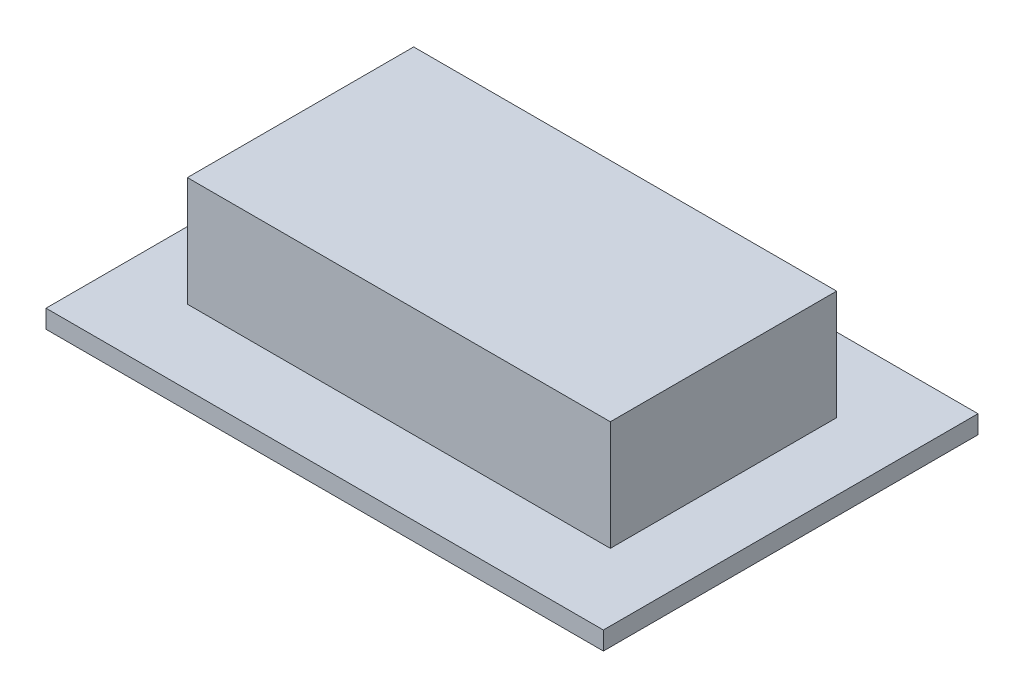
ISO-10303-21;
HEADER;
FILE_DESCRIPTION(('STEP AP214'),'2;1');
FILE_NAME('part.step','',(''),(''),'','','');
FILE_SCHEMA(('AUTOMOTIVE_DESIGN { 1 0 10303 214 1 1 1 1 }'));
ENDSEC;
DATA;
#1=APPLICATION_CONTEXT('core data for automotive mechanical design processes');
#2=APPLICATION_PROTOCOL_DEFINITION('international standard','automotive_design',2000,#1);
#3=PRODUCT_CONTEXT('',#1,'mechanical');
#4=PRODUCT('Part','Part','',(#3));
#5=PRODUCT_RELATED_PRODUCT_CATEGORY('part','',(#4));
#6=PRODUCT_DEFINITION_FORMATION('','',#4);
#7=PRODUCT_DEFINITION_CONTEXT('part definition',#1,'design');
#8=PRODUCT_DEFINITION('design','',#6,#7);
#9=PRODUCT_DEFINITION_SHAPE('','',#8);
#10=(LENGTH_UNIT() NAMED_UNIT(*) SI_UNIT(.MILLI.,.METRE.));
#11=(NAMED_UNIT(*) PLANE_ANGLE_UNIT() SI_UNIT($,.RADIAN.));
#12=(NAMED_UNIT(*) SI_UNIT($,.STERADIAN.) SOLID_ANGLE_UNIT());
#13=UNCERTAINTY_MEASURE_WITH_UNIT(LENGTH_MEASURE(1.E-05),#10,'distance_accuracy_value','');
#14=(GEOMETRIC_REPRESENTATION_CONTEXT(3) GLOBAL_UNCERTAINTY_ASSIGNED_CONTEXT((#13)) GLOBAL_UNIT_ASSIGNED_CONTEXT((#10,
#11,#12)) REPRESENTATION_CONTEXT('',''));
#15=CARTESIAN_POINT('',(0.,0.,0.));
#16=DIRECTION('',(0.,0.,1.));
#17=DIRECTION('',(1.,0.,0.));
#18=AXIS2_PLACEMENT_3D('',#15,#16,#17);
#19=CARTESIAN_POINT('',(0.,2.,0.));
#20=DIRECTION('',(0.,-1.,0.));
#21=DIRECTION('',(0.,0.,-1.));
#22=AXIS2_PLACEMENT_3D('',#19,#20,#21);
#23=PLANE('',#22);
#24=DIRECTION('',(0.,0.,-1.));
#25=VECTOR('',#24,1.);
#26=CARTESIAN_POINT('',(30.5,2.,20.5));
#27=LINE('',#26,#25);
#28=CARTESIAN_POINT('',(30.5,2.,20.5));
#29=VERTEX_POINT('',#28);
#30=CARTESIAN_POINT('',(30.5,2.,-20.5));
#31=VERTEX_POINT('',#30);
#32=EDGE_CURVE('E187',#29,#31,#27,.T.);
#33=ORIENTED_EDGE('',*,*,#32,.T.);
#34=DIRECTION('',(-1.,0.,0.));
#35=VECTOR('',#34,1.);
#36=CARTESIAN_POINT('',(-30.5,2.,-20.5));
#37=LINE('',#36,#35);
#38=CARTESIAN_POINT('',(-30.5,2.,-20.5));
#39=VERTEX_POINT('',#38);
#40=EDGE_CURVE('E190',#31,#39,#37,.T.);
#41=ORIENTED_EDGE('',*,*,#40,.T.);
#42=DIRECTION('',(0.,0.,1.));
#43=VECTOR('',#42,1.);
#44=CARTESIAN_POINT('',(-30.5,2.,20.5));
#45=LINE('',#44,#43);
#46=CARTESIAN_POINT('',(-30.5,2.,20.5));
#47=VERTEX_POINT('',#46);
#48=EDGE_CURVE('E193',#39,#47,#45,.T.);
#49=ORIENTED_EDGE('',*,*,#48,.T.);
#50=DIRECTION('',(1.,0.,0.));
#51=VECTOR('',#50,1.);
#52=CARTESIAN_POINT('',(-30.5,2.,20.5));
#53=LINE('',#52,#51);
#54=EDGE_CURVE('E195',#47,#29,#53,.T.);
#55=ORIENTED_EDGE('',*,*,#54,.T.);
#56=EDGE_LOOP('',(#33,#41,#49,#55));
#57=FACE_BOUND('',#56,.T.);
#58=DIRECTION('',(0.,0.,-1.));
#59=VECTOR('',#58,1.);
#60=CARTESIAN_POINT('',(23.1441638533903,2.,-12.383538891067));
#61=LINE('',#60,#59);
#62=CARTESIAN_POINT('',(23.1441638533903,2.,12.383538891067));
#63=VERTEX_POINT('',#62);
#64=CARTESIAN_POINT('',(23.1441638533903,2.,-12.383538891067));
#65=VERTEX_POINT('',#64);
#66=EDGE_CURVE('E148',#63,#65,#61,.T.);
#67=ORIENTED_EDGE('',*,*,#66,.F.);
#68=DIRECTION('',(1.,0.,0.));
#69=VECTOR('',#68,1.);
#70=CARTESIAN_POINT('',(-23.1441638533903,2.,12.383538891067));
#71=LINE('',#70,#69);
#72=CARTESIAN_POINT('',(-23.1441638533903,2.,12.383538891067));
#73=VERTEX_POINT('',#72);
#74=EDGE_CURVE('E161',#73,#63,#71,.T.);
#75=ORIENTED_EDGE('',*,*,#74,.F.);
#76=DIRECTION('',(0.,0.,1.));
#77=VECTOR('',#76,1.);
#78=CARTESIAN_POINT('',(-23.1441638533903,2.,-12.383538891067));
#79=LINE('',#78,#77);
#80=CARTESIAN_POINT('',(-23.1441638533903,2.,-12.383538891067));
#81=VERTEX_POINT('',#80);
#82=EDGE_CURVE('E170',#81,#73,#79,.T.);
#83=ORIENTED_EDGE('',*,*,#82,.F.);
#84=DIRECTION('',(-1.,0.,0.));
#85=VECTOR('',#84,1.);
#86=CARTESIAN_POINT('',(-23.1441638533903,2.,-12.383538891067));
#87=LINE('',#86,#85);
#88=EDGE_CURVE('E151',#65,#81,#87,.T.);
#89=ORIENTED_EDGE('',*,*,#88,.F.);
#90=EDGE_LOOP('',(#67,#75,#83,#89));
#91=FACE_BOUND('',#90,.T.);
#92=ADVANCED_FACE('F39',(#57,#91),#23,.F.);
#93=CARTESIAN_POINT('',(30.5,2.,20.5));
#94=DIRECTION('',(-1.,0.,0.));
#95=DIRECTION('',(0.,0.,1.));
#96=AXIS2_PLACEMENT_3D('',#93,#94,#95);
#97=PLANE('',#96);
#98=DIRECTION('',(0.,0.,-1.));
#99=VECTOR('',#98,1.);
#100=CARTESIAN_POINT('',(30.5,0.,20.5));
#101=LINE('',#100,#99);
#102=CARTESIAN_POINT('',(30.5,0.,20.5));
#103=VERTEX_POINT('',#102);
#104=CARTESIAN_POINT('',(30.5,0.,-20.5));
#105=VERTEX_POINT('',#104);
#106=EDGE_CURVE('E186',#103,#105,#101,.T.);
#107=ORIENTED_EDGE('',*,*,#106,.T.);
#108=DIRECTION('',(0.,-1.,0.));
#109=VECTOR('',#108,1.);
#110=CARTESIAN_POINT('',(30.5,2.,-20.5));
#111=LINE('',#110,#109);
#112=EDGE_CURVE('E11',#31,#105,#111,.T.);
#113=ORIENTED_EDGE('',*,*,#112,.F.);
#114=ORIENTED_EDGE('',*,*,#32,.F.);
#115=DIRECTION('',(0.,-1.,0.));
#116=VECTOR('',#115,1.);
#117=CARTESIAN_POINT('',(30.5,2.,20.5));
#118=LINE('',#117,#116);
#119=EDGE_CURVE('E197',#29,#103,#118,.T.);
#120=ORIENTED_EDGE('',*,*,#119,.T.);
#121=EDGE_LOOP('',(#107,#113,#114,#120));
#122=FACE_BOUND('',#121,.T.);
#123=ADVANCED_FACE('F41',(#122),#97,.F.);
#124=CARTESIAN_POINT('',(-30.5,2.,-20.5));
#125=DIRECTION('',(0.,0.,1.));
#126=DIRECTION('',(1.,0.,0.));
#127=AXIS2_PLACEMENT_3D('',#124,#125,#126);
#128=PLANE('',#127);
#129=DIRECTION('',(-1.,0.,0.));
#130=VECTOR('',#129,1.);
#131=CARTESIAN_POINT('',(-30.5,0.,-20.5));
#132=LINE('',#131,#130);
#133=CARTESIAN_POINT('',(-30.5,0.,-20.5));
#134=VERTEX_POINT('',#133);
#135=EDGE_CURVE('E200',#105,#134,#132,.T.);
#136=ORIENTED_EDGE('',*,*,#135,.T.);
#137=DIRECTION('',(0.,-1.,0.));
#138=VECTOR('',#137,1.);
#139=CARTESIAN_POINT('',(-30.5,2.,-20.5));
#140=LINE('',#139,#138);
#141=EDGE_CURVE('E47',#39,#134,#140,.T.);
#142=ORIENTED_EDGE('',*,*,#141,.F.);
#143=ORIENTED_EDGE('',*,*,#40,.F.);
#144=ORIENTED_EDGE('',*,*,#112,.T.);
#145=EDGE_LOOP('',(#136,#142,#143,#144));
#146=FACE_BOUND('',#145,.T.);
#147=ADVANCED_FACE('F230',(#146),#128,.F.);
#148=CARTESIAN_POINT('',(-30.5,2.,20.5));
#149=DIRECTION('',(1.,0.,0.));
#150=DIRECTION('',(0.,0.,-1.));
#151=AXIS2_PLACEMENT_3D('',#148,#149,#150);
#152=PLANE('',#151);
#153=DIRECTION('',(0.,0.,1.));
#154=VECTOR('',#153,1.);
#155=CARTESIAN_POINT('',(-30.5,0.,20.5));
#156=LINE('',#155,#154);
#157=CARTESIAN_POINT('',(-30.5,0.,20.5));
#158=VERTEX_POINT('',#157);
#159=EDGE_CURVE('E202',#134,#158,#156,.T.);
#160=ORIENTED_EDGE('',*,*,#159,.T.);
#161=DIRECTION('',(0.,-1.,0.));
#162=VECTOR('',#161,1.);
#163=CARTESIAN_POINT('',(-30.5,2.,20.5));
#164=LINE('',#163,#162);
#165=EDGE_CURVE('E207',#47,#158,#164,.T.);
#166=ORIENTED_EDGE('',*,*,#165,.F.);
#167=ORIENTED_EDGE('',*,*,#48,.F.);
#168=ORIENTED_EDGE('',*,*,#141,.T.);
#169=EDGE_LOOP('',(#160,#166,#167,#168));
#170=FACE_BOUND('',#169,.T.);
#171=ADVANCED_FACE('F214',(#170),#152,.F.);
#172=CARTESIAN_POINT('',(-30.5,2.,20.5));
#173=DIRECTION('',(0.,0.,-1.));
#174=DIRECTION('',(-1.,0.,0.));
#175=AXIS2_PLACEMENT_3D('',#172,#173,#174);
#176=PLANE('',#175);
#177=DIRECTION('',(1.,0.,0.));
#178=VECTOR('',#177,1.);
#179=CARTESIAN_POINT('',(-30.5,0.,20.5));
#180=LINE('',#179,#178);
#181=EDGE_CURVE('E191',#158,#103,#180,.T.);
#182=ORIENTED_EDGE('',*,*,#181,.T.);
#183=ORIENTED_EDGE('',*,*,#119,.F.);
#184=ORIENTED_EDGE('',*,*,#54,.F.);
#185=ORIENTED_EDGE('',*,*,#165,.T.);
#186=EDGE_LOOP('',(#182,#183,#184,#185));
#187=FACE_BOUND('',#186,.T.);
#188=ADVANCED_FACE('F223',(#187),#176,.F.);
#189=CARTESIAN_POINT('',(0.,0.,0.));
#190=DIRECTION('',(0.,-1.,0.));
#191=DIRECTION('',(0.,0.,-1.));
#192=AXIS2_PLACEMENT_3D('',#189,#190,#191);
#193=PLANE('',#192);
#194=DIRECTION('',(0.,0.,1.));
#195=VECTOR('',#194,1.);
#196=CARTESIAN_POINT('',(10.2642986810793,0.,7.47011110024687));
#197=LINE('',#196,#195);
#198=CARTESIAN_POINT('',(10.2642986810793,0.,-7.47011110024687));
#199=VERTEX_POINT('',#198);
#200=CARTESIAN_POINT('',(10.2642986810793,0.,7.47011110024687));
#201=VERTEX_POINT('',#200);
#202=EDGE_CURVE('E54',#199,#201,#197,.T.);
#203=ORIENTED_EDGE('',*,*,#202,.F.);
#204=DIRECTION('',(1.,0.,0.));
#205=VECTOR('',#204,1.);
#206=CARTESIAN_POINT('',(-10.2642986810793,0.,-7.47011110024687));
#207=LINE('',#206,#205);
#208=CARTESIAN_POINT('',(-10.2642986810793,0.,-7.47011110024687));
#209=VERTEX_POINT('',#208);
#210=EDGE_CURVE('E58',#209,#199,#207,.T.);
#211=ORIENTED_EDGE('',*,*,#210,.F.);
#212=DIRECTION('',(0.,0.,-1.));
#213=VECTOR('',#212,1.);
#214=CARTESIAN_POINT('',(-10.2642986810793,0.,7.47011110024687));
#215=LINE('',#214,#213);
#216=CARTESIAN_POINT('',(-10.2642986810793,0.,7.47011110024687));
#217=VERTEX_POINT('',#216);
#218=EDGE_CURVE('E374',#217,#209,#215,.T.);
#219=ORIENTED_EDGE('',*,*,#218,.F.);
#220=DIRECTION('',(-1.,0.,0.));
#221=VECTOR('',#220,1.);
#222=CARTESIAN_POINT('',(-10.2642986810793,0.,7.47011110024687));
#223=LINE('',#222,#221);
#224=EDGE_CURVE('E380',#201,#217,#223,.T.);
#225=ORIENTED_EDGE('',*,*,#224,.F.);
#226=EDGE_LOOP('',(#203,#211,#219,#225));
#227=FACE_BOUND('',#226,.T.);
#228=ORIENTED_EDGE('',*,*,#106,.F.);
#229=ORIENTED_EDGE('',*,*,#181,.F.);
#230=ORIENTED_EDGE('',*,*,#159,.F.);
#231=ORIENTED_EDGE('',*,*,#135,.F.);
#232=EDGE_LOOP('',(#228,#229,#230,#231));
#233=FACE_BOUND('',#232,.T.);
#234=ADVANCED_FACE('F220',(#227,#233),#193,.T.);
#235=CARTESIAN_POINT('',(23.1441638533903,14.,-12.383538891067));
#236=DIRECTION('',(-1.,0.,0.));
#237=DIRECTION('',(0.,0.,1.));
#238=AXIS2_PLACEMENT_3D('',#235,#236,#237);
#239=PLANE('',#238);
#240=ORIENTED_EDGE('',*,*,#66,.T.);
#241=DIRECTION('',(0.,-1.,0.));
#242=VECTOR('',#241,1.);
#243=CARTESIAN_POINT('',(23.1441638533903,14.,-12.383538891067));
#244=LINE('',#243,#242);
#245=CARTESIAN_POINT('',(23.1441638533903,14.,-12.383538891067));
#246=VERTEX_POINT('',#245);
#247=EDGE_CURVE('E183',#246,#65,#244,.T.);
#248=ORIENTED_EDGE('',*,*,#247,.F.);
#249=DIRECTION('',(0.,0.,-1.));
#250=VECTOR('',#249,1.);
#251=CARTESIAN_POINT('',(23.1441638533903,14.,-12.383538891067));
#252=LINE('',#251,#250);
#253=CARTESIAN_POINT('',(23.1441638533903,14.,12.383538891067));
#254=VERTEX_POINT('',#253);
#255=EDGE_CURVE('E157',#254,#246,#252,.T.);
#256=ORIENTED_EDGE('',*,*,#255,.F.);
#257=DIRECTION('',(0.,-1.,0.));
#258=VECTOR('',#257,1.);
#259=CARTESIAN_POINT('',(23.1441638533903,14.,12.383538891067));
#260=LINE('',#259,#258);
#261=EDGE_CURVE('E166',#254,#63,#260,.T.);
#262=ORIENTED_EDGE('',*,*,#261,.T.);
#263=EDGE_LOOP('',(#240,#248,#256,#262));
#264=FACE_BOUND('',#263,.T.);
#265=ADVANCED_FACE('F245',(#264),#239,.F.);
#266=CARTESIAN_POINT('',(-23.1441638533903,14.,-12.383538891067));
#267=DIRECTION('',(0.,0.,1.));
#268=DIRECTION('',(1.,0.,0.));
#269=AXIS2_PLACEMENT_3D('',#266,#267,#268);
#270=PLANE('',#269);
#271=ORIENTED_EDGE('',*,*,#88,.T.);
#272=DIRECTION('',(0.,-1.,0.));
#273=VECTOR('',#272,1.);
#274=CARTESIAN_POINT('',(-23.1441638533903,14.,-12.383538891067));
#275=LINE('',#274,#273);
#276=CARTESIAN_POINT('',(-23.1441638533903,14.,-12.383538891067));
#277=VERTEX_POINT('',#276);
#278=EDGE_CURVE('E180',#277,#81,#275,.T.);
#279=ORIENTED_EDGE('',*,*,#278,.F.);
#280=DIRECTION('',(-1.,0.,0.));
#281=VECTOR('',#280,1.);
#282=CARTESIAN_POINT('',(-23.1441638533903,14.,-12.383538891067));
#283=LINE('',#282,#281);
#284=EDGE_CURVE('E160',#246,#277,#283,.T.);
#285=ORIENTED_EDGE('',*,*,#284,.F.);
#286=ORIENTED_EDGE('',*,*,#247,.T.);
#287=EDGE_LOOP('',(#271,#279,#285,#286));
#288=FACE_BOUND('',#287,.T.);
#289=ADVANCED_FACE('F284',(#288),#270,.F.);
#290=CARTESIAN_POINT('',(-23.1441638533903,14.,-12.383538891067));
#291=DIRECTION('',(1.,0.,0.));
#292=DIRECTION('',(0.,0.,-1.));
#293=AXIS2_PLACEMENT_3D('',#290,#291,#292);
#294=PLANE('',#293);
#295=ORIENTED_EDGE('',*,*,#82,.T.);
#296=DIRECTION('',(0.,-1.,0.));
#297=VECTOR('',#296,1.);
#298=CARTESIAN_POINT('',(-23.1441638533903,14.,12.383538891067));
#299=LINE('',#298,#297);
#300=CARTESIAN_POINT('',(-23.1441638533903,14.,12.383538891067));
#301=VERTEX_POINT('',#300);
#302=EDGE_CURVE('E177',#301,#73,#299,.T.);
#303=ORIENTED_EDGE('',*,*,#302,.F.);
#304=DIRECTION('',(0.,0.,1.));
#305=VECTOR('',#304,1.);
#306=CARTESIAN_POINT('',(-23.1441638533903,14.,-12.383538891067));
#307=LINE('',#306,#305);
#308=EDGE_CURVE('E163',#277,#301,#307,.T.);
#309=ORIENTED_EDGE('',*,*,#308,.F.);
#310=ORIENTED_EDGE('',*,*,#278,.T.);
#311=EDGE_LOOP('',(#295,#303,#309,#310));
#312=FACE_BOUND('',#311,.T.);
#313=ADVANCED_FACE('F292',(#312),#294,.F.);
#314=CARTESIAN_POINT('',(-23.1441638533903,14.,12.383538891067));
#315=DIRECTION('',(0.,0.,-1.));
#316=DIRECTION('',(-1.,0.,0.));
#317=AXIS2_PLACEMENT_3D('',#314,#315,#316);
#318=PLANE('',#317);
#319=ORIENTED_EDGE('',*,*,#74,.T.);
#320=ORIENTED_EDGE('',*,*,#261,.F.);
#321=DIRECTION('',(1.,0.,0.));
#322=VECTOR('',#321,1.);
#323=CARTESIAN_POINT('',(-23.1441638533903,14.,12.383538891067));
#324=LINE('',#323,#322);
#325=EDGE_CURVE('E165',#301,#254,#324,.T.);
#326=ORIENTED_EDGE('',*,*,#325,.F.);
#327=ORIENTED_EDGE('',*,*,#302,.T.);
#328=EDGE_LOOP('',(#319,#320,#326,#327));
#329=FACE_BOUND('',#328,.T.);
#330=ADVANCED_FACE('F300',(#329),#318,.F.);
#331=CARTESIAN_POINT('',(0.,14.,0.));
#332=DIRECTION('',(0.,1.,0.));
#333=DIRECTION('',(0.,0.,1.));
#334=AXIS2_PLACEMENT_3D('',#331,#332,#333);
#335=PLANE('',#334);
#336=ORIENTED_EDGE('',*,*,#255,.T.);
#337=ORIENTED_EDGE('',*,*,#284,.T.);
#338=ORIENTED_EDGE('',*,*,#308,.T.);
#339=ORIENTED_EDGE('',*,*,#325,.T.);
#340=EDGE_LOOP('',(#336,#337,#338,#339));
#341=FACE_BOUND('',#340,.T.);
#342=ADVANCED_FACE('F309',(#341),#335,.T.);
#343=CARTESIAN_POINT('',(10.2642986810793,-12.,7.47011110024687));
#344=DIRECTION('',(-1.,0.,0.));
#345=DIRECTION('',(0.,0.,1.));
#346=AXIS2_PLACEMENT_3D('',#343,#344,#345);
#347=PLANE('',#346);
#348=ORIENTED_EDGE('',*,*,#202,.T.);
#349=DIRECTION('',(0.,1.,0.));
#350=VECTOR('',#349,1.);
#351=CARTESIAN_POINT('',(10.2642986810793,-12.,7.47011110024687));
#352=LINE('',#351,#350);
#353=CARTESIAN_POINT('',(10.2642986810793,-12.,7.47011110024687));
#354=VERTEX_POINT('',#353);
#355=EDGE_CURVE('E131',#354,#201,#352,.T.);
#356=ORIENTED_EDGE('',*,*,#355,.F.);
#357=DIRECTION('',(0.,0.,1.));
#358=VECTOR('',#357,1.);
#359=CARTESIAN_POINT('',(10.2642986810793,-12.,7.47011110024687));
#360=LINE('',#359,#358);
#361=CARTESIAN_POINT('',(10.2642986810793,-12.,-7.47011110024687));
#362=VERTEX_POINT('',#361);
#363=EDGE_CURVE('E137',#362,#354,#360,.T.);
#364=ORIENTED_EDGE('',*,*,#363,.F.);
#365=DIRECTION('',(0.,1.,0.));
#366=VECTOR('',#365,1.);
#367=CARTESIAN_POINT('',(10.2642986810793,-12.,-7.47011110024687));
#368=LINE('',#367,#366);
#369=EDGE_CURVE('E372',#362,#199,#368,.T.);
#370=ORIENTED_EDGE('',*,*,#369,.T.);
#371=EDGE_LOOP('',(#348,#356,#364,#370));
#372=FACE_BOUND('',#371,.T.);
#373=ADVANCED_FACE('F147',(#372),#347,.F.);
#374=CARTESIAN_POINT('',(-10.2642986810793,-12.,7.47011110024687));
#375=DIRECTION('',(0.,0.,-1.));
#376=DIRECTION('',(-1.,0.,0.));
#377=AXIS2_PLACEMENT_3D('',#374,#375,#376);
#378=PLANE('',#377);
#379=ORIENTED_EDGE('',*,*,#224,.T.);
#380=DIRECTION('',(0.,1.,0.));
#381=VECTOR('',#380,1.);
#382=CARTESIAN_POINT('',(-10.2642986810793,-12.,7.47011110024687));
#383=LINE('',#382,#381);
#384=CARTESIAN_POINT('',(-10.2642986810793,-12.,7.47011110024687));
#385=VERTEX_POINT('',#384);
#386=EDGE_CURVE('E133',#385,#217,#383,.T.);
#387=ORIENTED_EDGE('',*,*,#386,.F.);
#388=DIRECTION('',(-1.,0.,0.));
#389=VECTOR('',#388,1.);
#390=CARTESIAN_POINT('',(-10.2642986810793,-12.,7.47011110024687));
#391=LINE('',#390,#389);
#392=EDGE_CURVE('E126',#354,#385,#391,.T.);
#393=ORIENTED_EDGE('',*,*,#392,.F.);
#394=ORIENTED_EDGE('',*,*,#355,.T.);
#395=EDGE_LOOP('',(#379,#387,#393,#394));
#396=FACE_BOUND('',#395,.T.);
#397=ADVANCED_FACE('F129',(#396),#378,.F.);
#398=CARTESIAN_POINT('',(-10.2642986810793,-12.,7.47011110024687));
#399=DIRECTION('',(1.,0.,0.));
#400=DIRECTION('',(0.,0.,-1.));
#401=AXIS2_PLACEMENT_3D('',#398,#399,#400);
#402=PLANE('',#401);
#403=ORIENTED_EDGE('',*,*,#218,.T.);
#404=DIRECTION('',(0.,1.,0.));
#405=VECTOR('',#404,1.);
#406=CARTESIAN_POINT('',(-10.2642986810793,-12.,-7.47011110024687));
#407=LINE('',#406,#405);
#408=CARTESIAN_POINT('',(-10.2642986810793,-12.,-7.47011110024687));
#409=VERTEX_POINT('',#408);
#410=EDGE_CURVE('E153',#409,#209,#407,.T.);
#411=ORIENTED_EDGE('',*,*,#410,.F.);
#412=DIRECTION('',(0.,0.,-1.));
#413=VECTOR('',#412,1.);
#414=CARTESIAN_POINT('',(-10.2642986810793,-12.,7.47011110024687));
#415=LINE('',#414,#413);
#416=EDGE_CURVE('E136',#385,#409,#415,.T.);
#417=ORIENTED_EDGE('',*,*,#416,.F.);
#418=ORIENTED_EDGE('',*,*,#386,.T.);
#419=EDGE_LOOP('',(#403,#411,#417,#418));
#420=FACE_BOUND('',#419,.T.);
#421=ADVANCED_FACE('F333',(#420),#402,.F.);
#422=CARTESIAN_POINT('',(-10.2642986810793,-12.,-7.47011110024687));
#423=DIRECTION('',(0.,0.,1.));
#424=DIRECTION('',(1.,0.,0.));
#425=AXIS2_PLACEMENT_3D('',#422,#423,#424);
#426=PLANE('',#425);
#427=ORIENTED_EDGE('',*,*,#210,.T.);
#428=ORIENTED_EDGE('',*,*,#369,.F.);
#429=DIRECTION('',(1.,0.,0.));
#430=VECTOR('',#429,1.);
#431=CARTESIAN_POINT('',(-10.2642986810793,-12.,-7.47011110024687));
#432=LINE('',#431,#430);
#433=EDGE_CURVE('E142',#409,#362,#432,.T.);
#434=ORIENTED_EDGE('',*,*,#433,.F.);
#435=ORIENTED_EDGE('',*,*,#410,.T.);
#436=EDGE_LOOP('',(#427,#428,#434,#435));
#437=FACE_BOUND('',#436,.T.);
#438=ADVANCED_FACE('F341',(#437),#426,.F.);
#439=CARTESIAN_POINT('',(0.,-12.,0.));
#440=DIRECTION('',(0.,-1.,0.));
#441=DIRECTION('',(0.,0.,-1.));
#442=AXIS2_PLACEMENT_3D('',#439,#440,#441);
#443=PLANE('',#442);
#444=ORIENTED_EDGE('',*,*,#363,.T.);
#445=ORIENTED_EDGE('',*,*,#392,.T.);
#446=ORIENTED_EDGE('',*,*,#416,.T.);
#447=ORIENTED_EDGE('',*,*,#433,.T.);
#448=EDGE_LOOP('',(#444,#445,#446,#447));
#449=FACE_BOUND('',#448,.T.);
#450=ADVANCED_FACE('F140',(#449),#443,.T.);
#451=CLOSED_SHELL('',(#92,#123,#147,#171,#188,#234,#265,#289,#313,#330,#342,#373,#397,#421,#438,#450));
#452=MANIFOLD_SOLID_BREP('B2',#451);
#453=ADVANCED_BREP_SHAPE_REPRESENTATION('',(#18,#452),#14);
#454=SHAPE_DEFINITION_REPRESENTATION(#9,#453);
ENDSEC;
END-ISO-10303-21;
